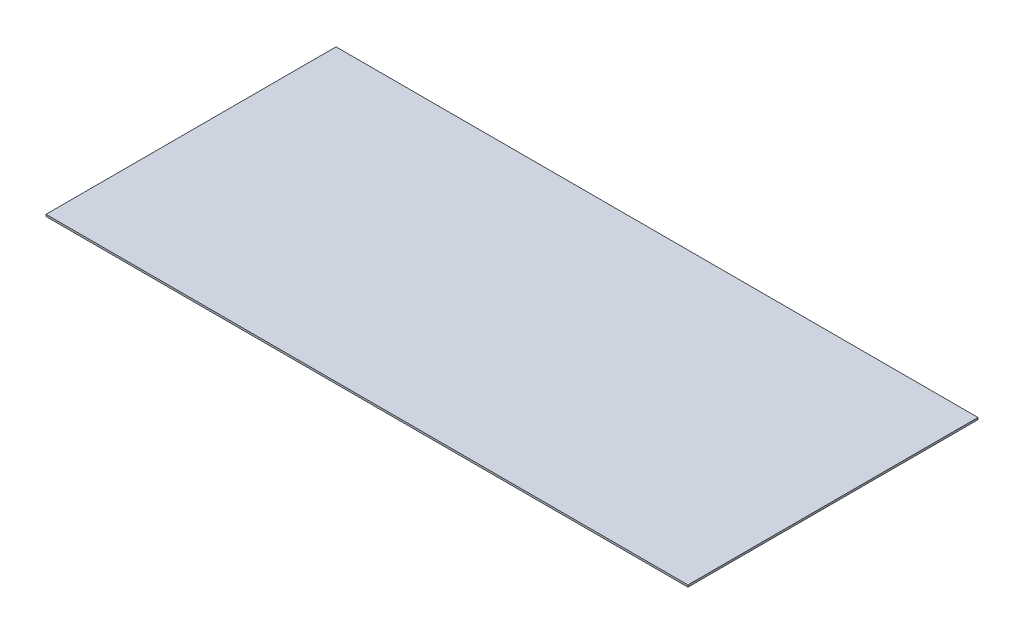
ISO-10303-21;
HEADER;
FILE_DESCRIPTION(('STEP AP214'),'2;1');
FILE_NAME('part.step','',(''),(''),'','','');
FILE_SCHEMA(('AUTOMOTIVE_DESIGN { 1 0 10303 214 1 1 1 1 }'));
ENDSEC;
DATA;
#1=APPLICATION_CONTEXT('core data for automotive mechanical design processes');
#2=APPLICATION_PROTOCOL_DEFINITION('international standard','automotive_design',2000,#1);
#3=PRODUCT_CONTEXT('',#1,'mechanical');
#4=PRODUCT('Part','Part','',(#3));
#5=PRODUCT_RELATED_PRODUCT_CATEGORY('part','',(#4));
#6=PRODUCT_DEFINITION_FORMATION('','',#4);
#7=PRODUCT_DEFINITION_CONTEXT('part definition',#1,'design');
#8=PRODUCT_DEFINITION('design','',#6,#7);
#9=PRODUCT_DEFINITION_SHAPE('','',#8);
#10=(LENGTH_UNIT() NAMED_UNIT(*) SI_UNIT(.MILLI.,.METRE.));
#11=(NAMED_UNIT(*) PLANE_ANGLE_UNIT() SI_UNIT($,.RADIAN.));
#12=(NAMED_UNIT(*) SI_UNIT($,.STERADIAN.) SOLID_ANGLE_UNIT());
#13=UNCERTAINTY_MEASURE_WITH_UNIT(LENGTH_MEASURE(1.E-05),#10,'distance_accuracy_value','');
#14=(GEOMETRIC_REPRESENTATION_CONTEXT(3) GLOBAL_UNCERTAINTY_ASSIGNED_CONTEXT((#13)) GLOBAL_UNIT_ASSIGNED_CONTEXT((#10,
#11,#12)) REPRESENTATION_CONTEXT('',''));
#15=CARTESIAN_POINT('',(0.,0.,0.));
#16=DIRECTION('',(0.,0.,1.));
#17=DIRECTION('',(1.,0.,0.));
#18=AXIS2_PLACEMENT_3D('',#15,#16,#17);
#19=CARTESIAN_POINT('',(0.,0.5,0.));
#20=DIRECTION('',(1.,0.,0.));
#21=DIRECTION('',(0.,0.,-1.));
#22=AXIS2_PLACEMENT_3D('',#19,#20,#21);
#23=PLANE('',#22);
#24=DIRECTION('',(0.,0.,1.));
#25=VECTOR('',#24,1.);
#26=CARTESIAN_POINT('',(0.,0.,0.));
#27=LINE('',#26,#25);
#28=CARTESIAN_POINT('',(0.,0.,-75.));
#29=VERTEX_POINT('',#28);
#30=CARTESIAN_POINT('',(0.,0.,0.));
#31=VERTEX_POINT('',#30);
#32=EDGE_CURVE('E95',#29,#31,#27,.T.);
#33=ORIENTED_EDGE('',*,*,#32,.T.);
#34=DIRECTION('',(0.,-1.,0.));
#35=VECTOR('',#34,1.);
#36=CARTESIAN_POINT('',(0.,0.5,0.));
#37=LINE('',#36,#35);
#38=CARTESIAN_POINT('',(0.,0.5,0.));
#39=VERTEX_POINT('',#38);
#40=EDGE_CURVE('E11',#39,#31,#37,.T.);
#41=ORIENTED_EDGE('',*,*,#40,.F.);
#42=DIRECTION('',(0.,0.,1.));
#43=VECTOR('',#42,1.);
#44=CARTESIAN_POINT('',(0.,0.5,0.));
#45=LINE('',#44,#43);
#46=CARTESIAN_POINT('',(0.,0.5,-75.));
#47=VERTEX_POINT('',#46);
#48=EDGE_CURVE('E83',#47,#39,#45,.T.);
#49=ORIENTED_EDGE('',*,*,#48,.F.);
#50=DIRECTION('',(0.,-1.,0.));
#51=VECTOR('',#50,1.);
#52=CARTESIAN_POINT('',(0.,0.5,-75.));
#53=LINE('',#52,#51);
#54=EDGE_CURVE('E91',#47,#29,#53,.T.);
#55=ORIENTED_EDGE('',*,*,#54,.T.);
#56=EDGE_LOOP('',(#33,#41,#49,#55));
#57=FACE_BOUND('',#56,.T.);
#58=ADVANCED_FACE('F32',(#57),#23,.F.);
#59=CARTESIAN_POINT('',(0.,0.5,0.));
#60=DIRECTION('',(0.,0.,-1.));
#61=DIRECTION('',(-1.,0.,0.));
#62=AXIS2_PLACEMENT_3D('',#59,#60,#61);
#63=PLANE('',#62);
#64=DIRECTION('',(1.,0.,0.));
#65=VECTOR('',#64,1.);
#66=CARTESIAN_POINT('',(0.,0.,0.));
#67=LINE('',#66,#65);
#68=CARTESIAN_POINT('',(166.,0.,0.));
#69=VERTEX_POINT('',#68);
#70=EDGE_CURVE('E87',#31,#69,#67,.T.);
#71=ORIENTED_EDGE('',*,*,#70,.T.);
#72=DIRECTION('',(0.,-1.,0.));
#73=VECTOR('',#72,1.);
#74=CARTESIAN_POINT('',(166.,0.5,0.));
#75=LINE('',#74,#73);
#76=CARTESIAN_POINT('',(166.,0.5,0.));
#77=VERTEX_POINT('',#76);
#78=EDGE_CURVE('E40',#77,#69,#75,.T.);
#79=ORIENTED_EDGE('',*,*,#78,.F.);
#80=DIRECTION('',(1.,0.,0.));
#81=VECTOR('',#80,1.);
#82=CARTESIAN_POINT('',(0.,0.5,0.));
#83=LINE('',#82,#81);
#84=EDGE_CURVE('E78',#39,#77,#83,.T.);
#85=ORIENTED_EDGE('',*,*,#84,.F.);
#86=ORIENTED_EDGE('',*,*,#40,.T.);
#87=EDGE_LOOP('',(#71,#79,#85,#86));
#88=FACE_BOUND('',#87,.T.);
#89=ADVANCED_FACE('F86',(#88),#63,.F.);
#90=CARTESIAN_POINT('',(166.,0.5,0.));
#91=DIRECTION('',(-1.,0.,0.));
#92=DIRECTION('',(0.,0.,1.));
#93=AXIS2_PLACEMENT_3D('',#90,#91,#92);
#94=PLANE('',#93);
#95=DIRECTION('',(0.,0.,-1.));
#96=VECTOR('',#95,1.);
#97=CARTESIAN_POINT('',(166.,0.,0.));
#98=LINE('',#97,#96);
#99=CARTESIAN_POINT('',(166.,0.,-75.));
#100=VERTEX_POINT('',#99);
#101=EDGE_CURVE('E65',#69,#100,#98,.T.);
#102=ORIENTED_EDGE('',*,*,#101,.T.);
#103=DIRECTION('',(0.,-1.,0.));
#104=VECTOR('',#103,1.);
#105=CARTESIAN_POINT('',(166.,0.5,-75.));
#106=LINE('',#105,#104);
#107=CARTESIAN_POINT('',(166.,0.5,-75.));
#108=VERTEX_POINT('',#107);
#109=EDGE_CURVE('E88',#108,#100,#106,.T.);
#110=ORIENTED_EDGE('',*,*,#109,.F.);
#111=DIRECTION('',(0.,0.,-1.));
#112=VECTOR('',#111,1.);
#113=CARTESIAN_POINT('',(166.,0.5,0.));
#114=LINE('',#113,#112);
#115=EDGE_CURVE('E81',#77,#108,#114,.T.);
#116=ORIENTED_EDGE('',*,*,#115,.F.);
#117=ORIENTED_EDGE('',*,*,#78,.T.);
#118=EDGE_LOOP('',(#102,#110,#116,#117));
#119=FACE_BOUND('',#118,.T.);
#120=ADVANCED_FACE('F89',(#119),#94,.F.);
#121=CARTESIAN_POINT('',(0.,0.5,-75.));
#122=DIRECTION('',(0.,0.,1.));
#123=DIRECTION('',(1.,0.,0.));
#124=AXIS2_PLACEMENT_3D('',#121,#122,#123);
#125=PLANE('',#124);
#126=DIRECTION('',(-1.,0.,0.));
#127=VECTOR('',#126,1.);
#128=CARTESIAN_POINT('',(0.,0.,-75.));
#129=LINE('',#128,#127);
#130=EDGE_CURVE('E71',#100,#29,#129,.T.);
#131=ORIENTED_EDGE('',*,*,#130,.T.);
#132=ORIENTED_EDGE('',*,*,#54,.F.);
#133=DIRECTION('',(-1.,0.,0.));
#134=VECTOR('',#133,1.);
#135=CARTESIAN_POINT('',(0.,0.5,-75.));
#136=LINE('',#135,#134);
#137=EDGE_CURVE('E48',#108,#47,#136,.T.);
#138=ORIENTED_EDGE('',*,*,#137,.F.);
#139=ORIENTED_EDGE('',*,*,#109,.T.);
#140=EDGE_LOOP('',(#131,#132,#138,#139));
#141=FACE_BOUND('',#140,.T.);
#142=ADVANCED_FACE('F102',(#141),#125,.F.);
#143=CARTESIAN_POINT('',(0.,0.5,0.));
#144=DIRECTION('',(0.,-1.,0.));
#145=DIRECTION('',(0.,0.,-1.));
#146=AXIS2_PLACEMENT_3D('',#143,#144,#145);
#147=PLANE('',#146);
#148=ORIENTED_EDGE('',*,*,#48,.T.);
#149=ORIENTED_EDGE('',*,*,#84,.T.);
#150=ORIENTED_EDGE('',*,*,#115,.T.);
#151=ORIENTED_EDGE('',*,*,#137,.T.);
#152=EDGE_LOOP('',(#148,#149,#150,#151));
#153=FACE_BOUND('',#152,.T.);
#154=ADVANCED_FACE('F79',(#153),#147,.F.);
#155=CARTESIAN_POINT('',(0.,0.,0.));
#156=DIRECTION('',(0.,-1.,0.));
#157=DIRECTION('',(0.,0.,-1.));
#158=AXIS2_PLACEMENT_3D('',#155,#156,#157);
#159=PLANE('',#158);
#160=ORIENTED_EDGE('',*,*,#32,.F.);
#161=ORIENTED_EDGE('',*,*,#130,.F.);
#162=ORIENTED_EDGE('',*,*,#101,.F.);
#163=ORIENTED_EDGE('',*,*,#70,.F.);
#164=EDGE_LOOP('',(#160,#161,#162,#163));
#165=FACE_BOUND('',#164,.T.);
#166=ADVANCED_FACE('F105',(#165),#159,.T.);
#167=CLOSED_SHELL('',(#58,#89,#120,#142,#154,#166));
#168=MANIFOLD_SOLID_BREP('B2',#167);
#169=ADVANCED_BREP_SHAPE_REPRESENTATION('',(#18,#168),#14);
#170=SHAPE_DEFINITION_REPRESENTATION(#9,#169);
ENDSEC;
END-ISO-10303-21;
